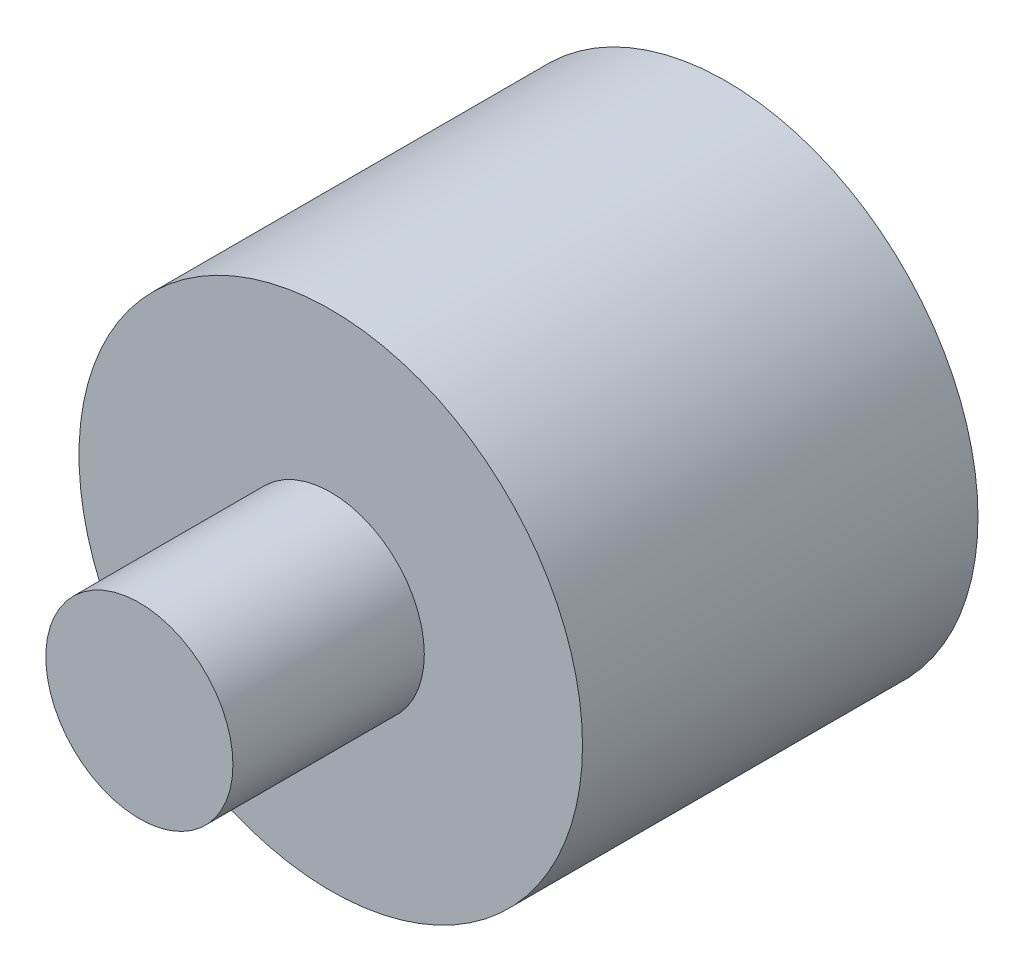
ISO-10303-21;
HEADER;
FILE_DESCRIPTION(('STEP AP214'),'2;1');
FILE_NAME('part.step','',(''),(''),'','','');
FILE_SCHEMA(('AUTOMOTIVE_DESIGN { 1 0 10303 214 1 1 1 1 }'));
ENDSEC;
DATA;
#1=APPLICATION_CONTEXT('core data for automotive mechanical design processes');
#2=APPLICATION_PROTOCOL_DEFINITION('international standard','automotive_design',2000,#1);
#3=PRODUCT_CONTEXT('',#1,'mechanical');
#4=PRODUCT('Part','Part','',(#3));
#5=PRODUCT_RELATED_PRODUCT_CATEGORY('part','',(#4));
#6=PRODUCT_DEFINITION_FORMATION('','',#4);
#7=PRODUCT_DEFINITION_CONTEXT('part definition',#1,'design');
#8=PRODUCT_DEFINITION('design','',#6,#7);
#9=PRODUCT_DEFINITION_SHAPE('','',#8);
#10=(LENGTH_UNIT() NAMED_UNIT(*) SI_UNIT(.MILLI.,.METRE.));
#11=(NAMED_UNIT(*) PLANE_ANGLE_UNIT() SI_UNIT($,.RADIAN.));
#12=(NAMED_UNIT(*) SI_UNIT($,.STERADIAN.) SOLID_ANGLE_UNIT());
#13=UNCERTAINTY_MEASURE_WITH_UNIT(LENGTH_MEASURE(1.E-05),#10,'distance_accuracy_value','');
#14=(GEOMETRIC_REPRESENTATION_CONTEXT(3) GLOBAL_UNCERTAINTY_ASSIGNED_CONTEXT((#13)) GLOBAL_UNIT_ASSIGNED_CONTEXT((#10,
#11,#12)) REPRESENTATION_CONTEXT('',''));
#15=CARTESIAN_POINT('',(0.,0.,0.));
#16=DIRECTION('',(0.,0.,1.));
#17=DIRECTION('',(1.,0.,0.));
#18=AXIS2_PLACEMENT_3D('',#15,#16,#17);
#19=CARTESIAN_POINT('',(0.,0.,236.22));
#20=DIRECTION('',(0.,0.,1.));
#21=DIRECTION('',(1.,0.,0.));
#22=AXIS2_PLACEMENT_3D('',#19,#20,#21);
#23=PLANE('',#22);
#24=CARTESIAN_POINT('',(0.,0.,236.22));
#25=DIRECTION('',(0.,0.,1.));
#26=DIRECTION('',(1.,0.,0.));
#27=AXIS2_PLACEMENT_3D('',#24,#25,#26);
#28=CIRCLE('',#27,150.368);
#29=CARTESIAN_POINT('',(150.368,0.,236.22));
#30=VERTEX_POINT('',#29);
#31=EDGE_CURVE('E10',#30,#30,#28,.T.);
#32=ORIENTED_EDGE('',*,*,#31,.T.);
#33=EDGE_LOOP('',(#32));
#34=FACE_BOUND('',#33,.T.);
#35=CARTESIAN_POINT('',(0.,0.,236.22));
#36=DIRECTION('',(0.,0.,1.));
#37=DIRECTION('',(1.,0.,0.));
#38=AXIS2_PLACEMENT_3D('',#35,#36,#37);
#39=CIRCLE('',#38,55.88);
#40=CARTESIAN_POINT('',(55.88,0.,236.22));
#41=VERTEX_POINT('',#40);
#42=EDGE_CURVE('E47',#41,#41,#39,.T.);
#43=ORIENTED_EDGE('',*,*,#42,.F.);
#44=EDGE_LOOP('',(#43));
#45=FACE_BOUND('',#44,.T.);
#46=ADVANCED_FACE('F34',(#34,#45),#23,.T.);
#47=CARTESIAN_POINT('',(0.,0.,236.22));
#48=DIRECTION('',(0.,0.,-1.));
#49=DIRECTION('',(-1.,0.,0.));
#50=AXIS2_PLACEMENT_3D('',#47,#48,#49);
#51=CYLINDRICAL_SURFACE('',#50,150.368);
#52=ORIENTED_EDGE('',*,*,#31,.F.);
#53=EDGE_LOOP('',(#52));
#54=FACE_BOUND('',#53,.T.);
#55=CARTESIAN_POINT('',(0.,0.,0.));
#56=DIRECTION('',(0.,0.,1.));
#57=DIRECTION('',(1.,0.,0.));
#58=AXIS2_PLACEMENT_3D('',#55,#56,#57);
#59=CIRCLE('',#58,150.368);
#60=CARTESIAN_POINT('',(150.368,0.,0.));
#61=VERTEX_POINT('',#60);
#62=EDGE_CURVE('E38',#61,#61,#59,.T.);
#63=ORIENTED_EDGE('',*,*,#62,.T.);
#64=EDGE_LOOP('',(#63));
#65=FACE_BOUND('',#64,.T.);
#66=ADVANCED_FACE('F36',(#54,#65),#51,.T.);
#67=CARTESIAN_POINT('',(0.,0.,0.));
#68=DIRECTION('',(0.,0.,1.));
#69=DIRECTION('',(1.,0.,0.));
#70=AXIS2_PLACEMENT_3D('',#67,#68,#69);
#71=PLANE('',#70);
#72=ORIENTED_EDGE('',*,*,#62,.F.);
#73=EDGE_LOOP('',(#72));
#74=FACE_BOUND('',#73,.T.);
#75=ADVANCED_FACE('F58',(#74),#71,.F.);
#76=CARTESIAN_POINT('',(0.,0.,350.52));
#77=DIRECTION('',(0.,0.,-1.));
#78=DIRECTION('',(-1.,0.,0.));
#79=AXIS2_PLACEMENT_3D('',#76,#77,#78);
#80=CYLINDRICAL_SURFACE('',#79,55.88);
#81=CARTESIAN_POINT('',(0.,0.,350.52));
#82=DIRECTION('',(0.,0.,1.));
#83=DIRECTION('',(1.,0.,0.));
#84=AXIS2_PLACEMENT_3D('',#81,#82,#83);
#85=CIRCLE('',#84,55.88);
#86=CARTESIAN_POINT('',(55.88,0.,350.52));
#87=VERTEX_POINT('',#86);
#88=EDGE_CURVE('E45',#87,#87,#85,.T.);
#89=ORIENTED_EDGE('',*,*,#88,.F.);
#90=EDGE_LOOP('',(#89));
#91=FACE_BOUND('',#90,.T.);
#92=ORIENTED_EDGE('',*,*,#42,.T.);
#93=EDGE_LOOP('',(#92));
#94=FACE_BOUND('',#93,.T.);
#95=ADVANCED_FACE('F55',(#91,#94),#80,.T.);
#96=CARTESIAN_POINT('',(0.,0.,350.52));
#97=DIRECTION('',(0.,0.,1.));
#98=DIRECTION('',(1.,0.,0.));
#99=AXIS2_PLACEMENT_3D('',#96,#97,#98);
#100=PLANE('',#99);
#101=ORIENTED_EDGE('',*,*,#88,.T.);
#102=EDGE_LOOP('',(#101));
#103=FACE_BOUND('',#102,.T.);
#104=ADVANCED_FACE('F53',(#103),#100,.T.);
#105=CLOSED_SHELL('',(#46,#66,#75,#95,#104));
#106=MANIFOLD_SOLID_BREP('B2',#105);
#107=ADVANCED_BREP_SHAPE_REPRESENTATION('',(#18,#106),#14);
#108=SHAPE_DEFINITION_REPRESENTATION(#9,#107);
ENDSEC;
END-ISO-10303-21;
